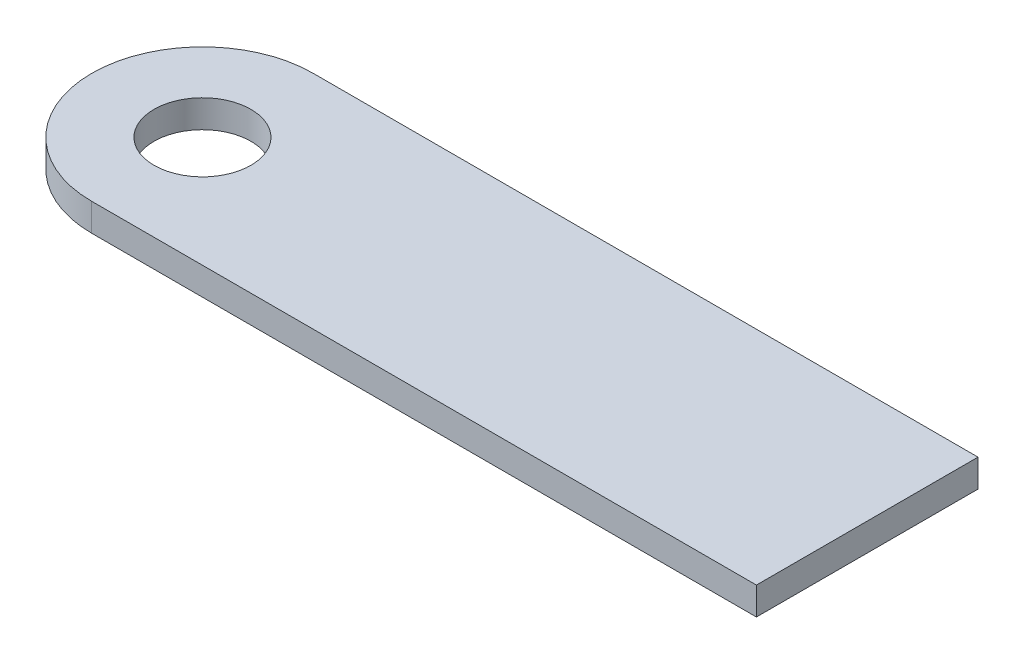
ISO-10303-21;
HEADER;
FILE_DESCRIPTION(('STEP AP214'),'2;1');
FILE_NAME('part.step','',(''),(''),'','','');
FILE_SCHEMA(('AUTOMOTIVE_DESIGN { 1 0 10303 214 1 1 1 1 }'));
ENDSEC;
DATA;
#1=APPLICATION_CONTEXT('core data for automotive mechanical design processes');
#2=APPLICATION_PROTOCOL_DEFINITION('international standard','automotive_design',2000,#1);
#3=PRODUCT_CONTEXT('',#1,'mechanical');
#4=PRODUCT('Part','Part','',(#3));
#5=PRODUCT_RELATED_PRODUCT_CATEGORY('part','',(#4));
#6=PRODUCT_DEFINITION_FORMATION('','',#4);
#7=PRODUCT_DEFINITION_CONTEXT('part definition',#1,'design');
#8=PRODUCT_DEFINITION('design','',#6,#7);
#9=PRODUCT_DEFINITION_SHAPE('','',#8);
#10=(LENGTH_UNIT() NAMED_UNIT(*) SI_UNIT(.MILLI.,.METRE.));
#11=(NAMED_UNIT(*) PLANE_ANGLE_UNIT() SI_UNIT($,.RADIAN.));
#12=(NAMED_UNIT(*) SI_UNIT($,.STERADIAN.) SOLID_ANGLE_UNIT());
#13=UNCERTAINTY_MEASURE_WITH_UNIT(LENGTH_MEASURE(1.E-05),#10,'distance_accuracy_value','');
#14=(GEOMETRIC_REPRESENTATION_CONTEXT(3) GLOBAL_UNCERTAINTY_ASSIGNED_CONTEXT((#13)) GLOBAL_UNIT_ASSIGNED_CONTEXT((#10,
#11,#12)) REPRESENTATION_CONTEXT('',''));
#15=CARTESIAN_POINT('',(0.,0.,0.));
#16=DIRECTION('',(0.,0.,1.));
#17=DIRECTION('',(1.,0.,0.));
#18=AXIS2_PLACEMENT_3D('',#15,#16,#17);
#19=CARTESIAN_POINT('',(-38.1000000000005,3.175,0.));
#20=DIRECTION('',(0.,1.,0.));
#21=DIRECTION('',(0.,0.,1.));
#22=AXIS2_PLACEMENT_3D('',#19,#20,#21);
#23=PLANE('',#22);
#24=CARTESIAN_POINT('',(-38.1000000000005,3.175,0.));
#25=DIRECTION('',(0.,1.,0.));
#26=DIRECTION('',(0.,0.,1.));
#27=AXIS2_PLACEMENT_3D('',#24,#25,#26);
#28=CIRCLE('',#27,12.7);
#29=CARTESIAN_POINT('',(-38.1000000000005,3.175,-12.7));
#30=VERTEX_POINT('',#29);
#31=CARTESIAN_POINT('',(-38.1000000000005,3.175,12.7));
#32=VERTEX_POINT('',#31);
#33=EDGE_CURVE('E92',#30,#32,#28,.T.);
#34=ORIENTED_EDGE('',*,*,#33,.T.);
#35=DIRECTION('',(1.,0.,0.));
#36=VECTOR('',#35,1.);
#37=CARTESIAN_POINT('',(38.0999999999995,3.175,12.7));
#38=LINE('',#37,#36);
#39=CARTESIAN_POINT('',(38.0999999999995,3.175,12.7));
#40=VERTEX_POINT('',#39);
#41=EDGE_CURVE('E87',#32,#40,#38,.T.);
#42=ORIENTED_EDGE('',*,*,#41,.T.);
#43=DIRECTION('',(0.,0.,-1.));
#44=VECTOR('',#43,1.);
#45=CARTESIAN_POINT('',(38.0999999999995,3.175,12.7));
#46=LINE('',#45,#44);
#47=CARTESIAN_POINT('',(38.0999999999995,3.175,-12.7));
#48=VERTEX_POINT('',#47);
#49=EDGE_CURVE('E90',#40,#48,#46,.T.);
#50=ORIENTED_EDGE('',*,*,#49,.T.);
#51=DIRECTION('',(-1.,0.,0.));
#52=VECTOR('',#51,1.);
#53=CARTESIAN_POINT('',(38.0999999999995,3.175,-12.7));
#54=LINE('',#53,#52);
#55=EDGE_CURVE('E57',#48,#30,#54,.T.);
#56=ORIENTED_EDGE('',*,*,#55,.T.);
#57=EDGE_LOOP('',(#34,#42,#50,#56));
#58=FACE_BOUND('',#57,.T.);
#59=CARTESIAN_POINT('',(-38.1000000000005,3.175,0.));
#60=DIRECTION('',(0.,1.,0.));
#61=DIRECTION('',(0.,0.,1.));
#62=AXIS2_PLACEMENT_3D('',#59,#60,#61);
#63=CIRCLE('',#62,5.55624999999992);
#64=CARTESIAN_POINT('',(-38.1000000000005,3.175,5.55624999999991));
#65=VERTEX_POINT('',#64);
#66=EDGE_CURVE('E112',#65,#65,#63,.T.);
#67=ORIENTED_EDGE('',*,*,#66,.F.);
#68=EDGE_LOOP('',(#67));
#69=FACE_BOUND('',#68,.T.);
#70=ADVANCED_FACE('F39',(#58,#69),#23,.T.);
#71=CARTESIAN_POINT('',(-38.1000000000005,0.,0.));
#72=DIRECTION('',(0.,1.,0.));
#73=DIRECTION('',(0.,0.,1.));
#74=AXIS2_PLACEMENT_3D('',#71,#72,#73);
#75=PLANE('',#74);
#76=CARTESIAN_POINT('',(-38.1000000000005,0.,0.));
#77=DIRECTION('',(0.,1.,0.));
#78=DIRECTION('',(0.,0.,1.));
#79=AXIS2_PLACEMENT_3D('',#76,#77,#78);
#80=CIRCLE('',#79,12.7);
#81=CARTESIAN_POINT('',(-38.1000000000005,0.,-12.7));
#82=VERTEX_POINT('',#81);
#83=CARTESIAN_POINT('',(-38.1000000000005,0.,12.7));
#84=VERTEX_POINT('',#83);
#85=EDGE_CURVE('E108',#82,#84,#80,.T.);
#86=ORIENTED_EDGE('',*,*,#85,.F.);
#87=DIRECTION('',(-1.,0.,0.));
#88=VECTOR('',#87,1.);
#89=CARTESIAN_POINT('',(38.0999999999995,0.,-12.7));
#90=LINE('',#89,#88);
#91=CARTESIAN_POINT('',(38.0999999999995,0.,-12.7));
#92=VERTEX_POINT('',#91);
#93=EDGE_CURVE('E80',#92,#82,#90,.T.);
#94=ORIENTED_EDGE('',*,*,#93,.F.);
#95=DIRECTION('',(0.,0.,-1.));
#96=VECTOR('',#95,1.);
#97=CARTESIAN_POINT('',(38.0999999999995,0.,12.7));
#98=LINE('',#97,#96);
#99=CARTESIAN_POINT('',(38.0999999999995,0.,12.7));
#100=VERTEX_POINT('',#99);
#101=EDGE_CURVE('E74',#100,#92,#98,.T.);
#102=ORIENTED_EDGE('',*,*,#101,.F.);
#103=DIRECTION('',(1.,0.,0.));
#104=VECTOR('',#103,1.);
#105=CARTESIAN_POINT('',(38.0999999999995,0.,12.7));
#106=LINE('',#105,#104);
#107=EDGE_CURVE('E97',#84,#100,#106,.T.);
#108=ORIENTED_EDGE('',*,*,#107,.F.);
#109=EDGE_LOOP('',(#86,#94,#102,#108));
#110=FACE_BOUND('',#109,.T.);
#111=CARTESIAN_POINT('',(-38.1000000000005,0.,0.));
#112=DIRECTION('',(0.,1.,0.));
#113=DIRECTION('',(0.,0.,1.));
#114=AXIS2_PLACEMENT_3D('',#111,#112,#113);
#115=CIRCLE('',#114,5.55624999999992);
#116=CARTESIAN_POINT('',(-38.1000000000005,0.,5.55624999999991));
#117=VERTEX_POINT('',#116);
#118=EDGE_CURVE('E130',#117,#117,#115,.T.);
#119=ORIENTED_EDGE('',*,*,#118,.T.);
#120=EDGE_LOOP('',(#119));
#121=FACE_BOUND('',#120,.T.);
#122=ADVANCED_FACE('F125',(#110,#121),#75,.F.);
#123=CARTESIAN_POINT('',(-38.1000000000005,3.175,0.));
#124=DIRECTION('',(0.,-1.,0.));
#125=DIRECTION('',(0.,0.,-1.));
#126=AXIS2_PLACEMENT_3D('',#123,#124,#125);
#127=CYLINDRICAL_SURFACE('',#126,12.7);
#128=ORIENTED_EDGE('',*,*,#85,.T.);
#129=DIRECTION('',(0.,-1.,0.));
#130=VECTOR('',#129,1.);
#131=CARTESIAN_POINT('',(-38.1000000000005,3.175,12.7));
#132=LINE('',#131,#130);
#133=EDGE_CURVE('E11',#32,#84,#132,.T.);
#134=ORIENTED_EDGE('',*,*,#133,.F.);
#135=ORIENTED_EDGE('',*,*,#33,.F.);
#136=DIRECTION('',(0.,-1.,0.));
#137=VECTOR('',#136,1.);
#138=CARTESIAN_POINT('',(-38.1000000000005,3.175,-12.7));
#139=LINE('',#138,#137);
#140=EDGE_CURVE('E104',#30,#82,#139,.T.);
#141=ORIENTED_EDGE('',*,*,#140,.T.);
#142=EDGE_LOOP('',(#128,#134,#135,#141));
#143=FACE_BOUND('',#142,.T.);
#144=ADVANCED_FACE('F41',(#143),#127,.T.);
#145=CARTESIAN_POINT('',(38.0999999999995,3.175,12.7));
#146=DIRECTION('',(0.,0.,-1.));
#147=DIRECTION('',(-1.,0.,0.));
#148=AXIS2_PLACEMENT_3D('',#145,#146,#147);
#149=PLANE('',#148);
#150=ORIENTED_EDGE('',*,*,#107,.T.);
#151=DIRECTION('',(0.,-1.,0.));
#152=VECTOR('',#151,1.);
#153=CARTESIAN_POINT('',(38.0999999999995,3.175,12.7));
#154=LINE('',#153,#152);
#155=EDGE_CURVE('E49',#40,#100,#154,.T.);
#156=ORIENTED_EDGE('',*,*,#155,.F.);
#157=ORIENTED_EDGE('',*,*,#41,.F.);
#158=ORIENTED_EDGE('',*,*,#133,.T.);
#159=EDGE_LOOP('',(#150,#156,#157,#158));
#160=FACE_BOUND('',#159,.T.);
#161=ADVANCED_FACE('F96',(#160),#149,.F.);
#162=CARTESIAN_POINT('',(38.0999999999995,3.175,12.7));
#163=DIRECTION('',(-1.,0.,0.));
#164=DIRECTION('',(0.,0.,1.));
#165=AXIS2_PLACEMENT_3D('',#162,#163,#164);
#166=PLANE('',#165);
#167=ORIENTED_EDGE('',*,*,#101,.T.);
#168=DIRECTION('',(0.,-1.,0.));
#169=VECTOR('',#168,1.);
#170=CARTESIAN_POINT('',(38.0999999999995,3.175,-12.7));
#171=LINE('',#170,#169);
#172=EDGE_CURVE('E99',#48,#92,#171,.T.);
#173=ORIENTED_EDGE('',*,*,#172,.F.);
#174=ORIENTED_EDGE('',*,*,#49,.F.);
#175=ORIENTED_EDGE('',*,*,#155,.T.);
#176=EDGE_LOOP('',(#167,#173,#174,#175));
#177=FACE_BOUND('',#176,.T.);
#178=ADVANCED_FACE('F100',(#177),#166,.F.);
#179=CARTESIAN_POINT('',(38.0999999999995,3.175,-12.7));
#180=DIRECTION('',(0.,0.,1.));
#181=DIRECTION('',(1.,0.,0.));
#182=AXIS2_PLACEMENT_3D('',#179,#180,#181);
#183=PLANE('',#182);
#184=ORIENTED_EDGE('',*,*,#93,.T.);
#185=ORIENTED_EDGE('',*,*,#140,.F.);
#186=ORIENTED_EDGE('',*,*,#55,.F.);
#187=ORIENTED_EDGE('',*,*,#172,.T.);
#188=EDGE_LOOP('',(#184,#185,#186,#187));
#189=FACE_BOUND('',#188,.T.);
#190=ADVANCED_FACE('F122',(#189),#183,.F.);
#191=CARTESIAN_POINT('',(-38.1000000000005,3.175,0.));
#192=DIRECTION('',(0.,-1.,0.));
#193=DIRECTION('',(0.,0.,-1.));
#194=AXIS2_PLACEMENT_3D('',#191,#192,#193);
#195=CYLINDRICAL_SURFACE('',#194,5.55624999999992);
#196=ORIENTED_EDGE('',*,*,#66,.T.);
#197=EDGE_LOOP('',(#196));
#198=FACE_BOUND('',#197,.T.);
#199=ORIENTED_EDGE('',*,*,#118,.F.);
#200=EDGE_LOOP('',(#199));
#201=FACE_BOUND('',#200,.T.);
#202=ADVANCED_FACE('F138',(#198,#201),#195,.F.);
#203=CLOSED_SHELL('',(#70,#122,#144,#161,#178,#190,#202));
#204=MANIFOLD_SOLID_BREP('B2',#203);
#205=ADVANCED_BREP_SHAPE_REPRESENTATION('',(#18,#204),#14);
#206=SHAPE_DEFINITION_REPRESENTATION(#9,#205);
ENDSEC;
END-ISO-10303-21;
